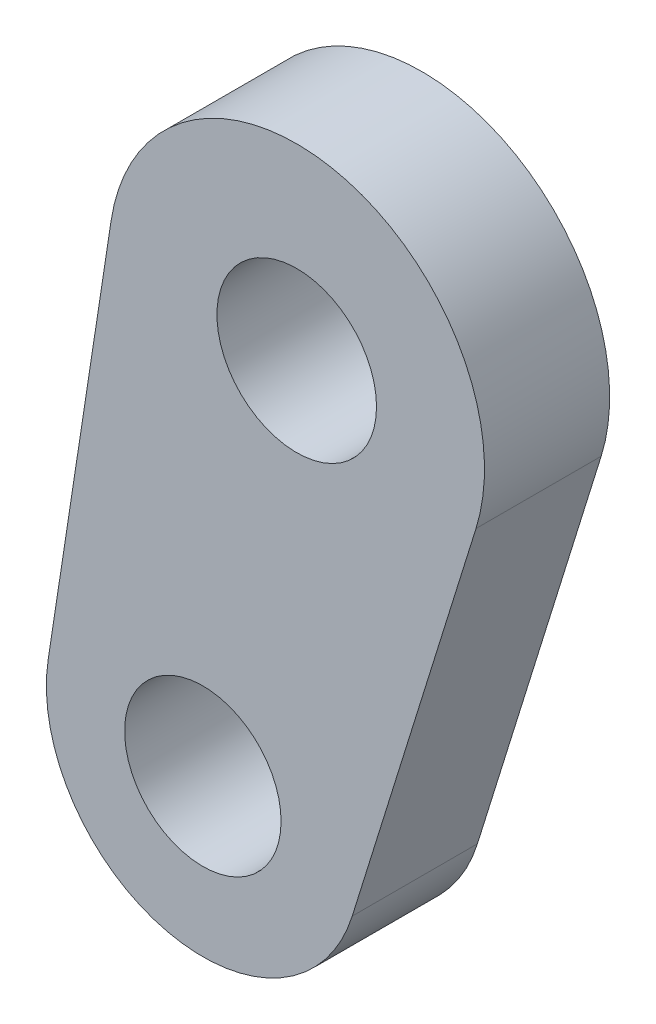
ISO-10303-21;
HEADER;
FILE_DESCRIPTION(('STEP AP214'),'2;1');
FILE_NAME('part.step','',(''),(''),'','','');
FILE_SCHEMA(('AUTOMOTIVE_DESIGN { 1 0 10303 214 1 1 1 1 }'));
ENDSEC;
DATA;
#1=APPLICATION_CONTEXT('core data for automotive mechanical design processes');
#2=APPLICATION_PROTOCOL_DEFINITION('international standard','automotive_design',2000,#1);
#3=PRODUCT_CONTEXT('',#1,'mechanical');
#4=PRODUCT('Part','Part','',(#3));
#5=PRODUCT_RELATED_PRODUCT_CATEGORY('part','',(#4));
#6=PRODUCT_DEFINITION_FORMATION('','',#4);
#7=PRODUCT_DEFINITION_CONTEXT('part definition',#1,'design');
#8=PRODUCT_DEFINITION('design','',#6,#7);
#9=PRODUCT_DEFINITION_SHAPE('','',#8);
#10=(LENGTH_UNIT() NAMED_UNIT(*) SI_UNIT(.MILLI.,.METRE.));
#11=(NAMED_UNIT(*) PLANE_ANGLE_UNIT() SI_UNIT($,.RADIAN.));
#12=(NAMED_UNIT(*) SI_UNIT($,.STERADIAN.) SOLID_ANGLE_UNIT());
#13=UNCERTAINTY_MEASURE_WITH_UNIT(LENGTH_MEASURE(1.E-05),#10,'distance_accuracy_value','');
#14=(GEOMETRIC_REPRESENTATION_CONTEXT(3) GLOBAL_UNCERTAINTY_ASSIGNED_CONTEXT((#13)) GLOBAL_UNIT_ASSIGNED_CONTEXT((#10,
#11,#12)) REPRESENTATION_CONTEXT('',''));
#15=CARTESIAN_POINT('',(0.,0.,0.));
#16=DIRECTION('',(0.,0.,1.));
#17=DIRECTION('',(1.,0.,0.));
#18=AXIS2_PLACEMENT_3D('',#15,#16,#17);
#19=CARTESIAN_POINT('',(-6.,-26.,52.4));
#20=DIRECTION('',(0.,0.,1.));
#21=DIRECTION('',(1.,0.,0.));
#22=AXIS2_PLACEMENT_3D('',#19,#20,#21);
#23=PLANE('',#22);
#24=CARTESIAN_POINT('',(0.,0.,52.4));
#25=DIRECTION('',(0.,0.,1.));
#26=DIRECTION('',(1.,0.,0.));
#27=AXIS2_PLACEMENT_3D('',#24,#25,#26);
#28=CIRCLE('',#27,5.1);
#29=CARTESIAN_POINT('',(5.1,0.,52.4));
#30=VERTEX_POINT('',#29);
#31=EDGE_CURVE('E103',#30,#30,#28,.T.);
#32=ORIENTED_EDGE('',*,*,#31,.F.);
#33=EDGE_LOOP('',(#32));
#34=FACE_BOUND('',#33,.T.);
#35=CARTESIAN_POINT('',(-6.,-26.,52.4));
#36=DIRECTION('',(0.,0.,1.));
#37=DIRECTION('',(1.,0.,0.));
#38=AXIS2_PLACEMENT_3D('',#35,#36,#37);
#39=CIRCLE('',#38,10.);
#40=CARTESIAN_POINT('',(-15.8850421934523,-24.4880671861264,52.4));
#41=VERTEX_POINT('',#40);
#42=CARTESIAN_POINT('',(3.5479635417669,-28.972606971177,52.4));
#43=VERTEX_POINT('',#42);
#44=EDGE_CURVE('E88',#41,#43,#39,.T.);
#45=ORIENTED_EDGE('',*,*,#44,.T.);
#46=DIRECTION('',(0.297260697117698,0.95479635417669,0.));
#47=VECTOR('',#46,1.);
#48=CARTESIAN_POINT('',(3.5479635417669,-28.972606971177,52.4));
#49=LINE('',#48,#47);
#50=CARTESIAN_POINT('',(11.4575562501203,-3.56712836541238,52.4));
#51=VERTEX_POINT('',#50);
#52=EDGE_CURVE('E83',#43,#51,#49,.T.);
#53=ORIENTED_EDGE('',*,*,#52,.T.);
#54=CARTESIAN_POINT('',(0.,0.,52.4));
#55=DIRECTION('',(0.,0.,1.));
#56=DIRECTION('',(1.,0.,0.));
#57=AXIS2_PLACEMENT_3D('',#54,#55,#56);
#58=CIRCLE('',#57,12.);
#59=CARTESIAN_POINT('',(-11.8620506321428,1.81431937664832,52.4));
#60=VERTEX_POINT('',#59);
#61=EDGE_CURVE('E86',#51,#60,#58,.T.);
#62=ORIENTED_EDGE('',*,*,#61,.T.);
#63=DIRECTION('',(-0.151193281387361,-0.98850421934523,0.));
#64=VECTOR('',#63,1.);
#65=CARTESIAN_POINT('',(-11.8620506321428,1.81431937664833,52.4));
#66=LINE('',#65,#64);
#67=EDGE_CURVE('E53',#60,#41,#66,.T.);
#68=ORIENTED_EDGE('',*,*,#67,.T.);
#69=EDGE_LOOP('',(#45,#53,#62,#68));
#70=FACE_BOUND('',#69,.T.);
#71=CARTESIAN_POINT('',(-6.,-26.,52.4));
#72=DIRECTION('',(0.,0.,1.));
#73=DIRECTION('',(1.,0.,0.));
#74=AXIS2_PLACEMENT_3D('',#71,#72,#73);
#75=CIRCLE('',#74,5.);
#76=CARTESIAN_POINT('',(-1.,-26.,52.4));
#77=VERTEX_POINT('',#76);
#78=EDGE_CURVE('E118',#77,#77,#75,.T.);
#79=ORIENTED_EDGE('',*,*,#78,.F.);
#80=EDGE_LOOP('',(#79));
#81=FACE_BOUND('',#80,.T.);
#82=ADVANCED_FACE('F36',(#34,#70,#81),#23,.T.);
#83=CARTESIAN_POINT('',(-6.,-26.,44.4));
#84=DIRECTION('',(0.,0.,1.));
#85=DIRECTION('',(1.,0.,0.));
#86=AXIS2_PLACEMENT_3D('',#83,#84,#85);
#87=PLANE('',#86);
#88=CARTESIAN_POINT('',(-6.,-26.,44.4));
#89=DIRECTION('',(0.,0.,1.));
#90=DIRECTION('',(1.,0.,0.));
#91=AXIS2_PLACEMENT_3D('',#88,#89,#90);
#92=CIRCLE('',#91,10.);
#93=CARTESIAN_POINT('',(-15.8850421934523,-24.4880671861264,44.4));
#94=VERTEX_POINT('',#93);
#95=CARTESIAN_POINT('',(3.5479635417669,-28.972606971177,44.4));
#96=VERTEX_POINT('',#95);
#97=EDGE_CURVE('E100',#94,#96,#92,.T.);
#98=ORIENTED_EDGE('',*,*,#97,.F.);
#99=DIRECTION('',(-0.151193281387361,-0.98850421934523,0.));
#100=VECTOR('',#99,1.);
#101=CARTESIAN_POINT('',(-11.8620506321428,1.81431937664833,44.4));
#102=LINE('',#101,#100);
#103=CARTESIAN_POINT('',(-11.8620506321428,1.81431937664832,44.4));
#104=VERTEX_POINT('',#103);
#105=EDGE_CURVE('E76',#104,#94,#102,.T.);
#106=ORIENTED_EDGE('',*,*,#105,.F.);
#107=CARTESIAN_POINT('',(0.,0.,44.4));
#108=DIRECTION('',(0.,0.,1.));
#109=DIRECTION('',(1.,0.,0.));
#110=AXIS2_PLACEMENT_3D('',#107,#108,#109);
#111=CIRCLE('',#110,12.);
#112=CARTESIAN_POINT('',(11.4575562501203,-3.56712836541238,44.4));
#113=VERTEX_POINT('',#112);
#114=EDGE_CURVE('E70',#113,#104,#111,.T.);
#115=ORIENTED_EDGE('',*,*,#114,.F.);
#116=DIRECTION('',(0.297260697117698,0.95479635417669,0.));
#117=VECTOR('',#116,1.);
#118=CARTESIAN_POINT('',(3.5479635417669,-28.972606971177,44.4));
#119=LINE('',#118,#117);
#120=EDGE_CURVE('E92',#96,#113,#119,.T.);
#121=ORIENTED_EDGE('',*,*,#120,.F.);
#122=EDGE_LOOP('',(#98,#106,#115,#121));
#123=FACE_BOUND('',#122,.T.);
#124=CARTESIAN_POINT('',(0.,0.,44.4));
#125=DIRECTION('',(0.,0.,1.));
#126=DIRECTION('',(1.,0.,0.));
#127=AXIS2_PLACEMENT_3D('',#124,#125,#126);
#128=CIRCLE('',#127,5.1);
#129=CARTESIAN_POINT('',(5.1,0.,44.4));
#130=VERTEX_POINT('',#129);
#131=EDGE_CURVE('E115',#130,#130,#128,.T.);
#132=ORIENTED_EDGE('',*,*,#131,.T.);
#133=EDGE_LOOP('',(#132));
#134=FACE_BOUND('',#133,.T.);
#135=CARTESIAN_POINT('',(-6.,-26.,44.4));
#136=DIRECTION('',(0.,0.,1.));
#137=DIRECTION('',(1.,0.,0.));
#138=AXIS2_PLACEMENT_3D('',#135,#136,#137);
#139=CIRCLE('',#138,5.);
#140=CARTESIAN_POINT('',(-1.,-26.,44.4));
#141=VERTEX_POINT('',#140);
#142=EDGE_CURVE('E121',#141,#141,#139,.T.);
#143=ORIENTED_EDGE('',*,*,#142,.T.);
#144=EDGE_LOOP('',(#143));
#145=FACE_BOUND('',#144,.T.);
#146=ADVANCED_FACE('F111',(#123,#134,#145),#87,.F.);
#147=CARTESIAN_POINT('',(-6.,-26.,52.4));
#148=DIRECTION('',(0.,0.,-1.));
#149=DIRECTION('',(-1.,0.,0.));
#150=AXIS2_PLACEMENT_3D('',#147,#148,#149);
#151=CYLINDRICAL_SURFACE('',#150,10.);
#152=ORIENTED_EDGE('',*,*,#97,.T.);
#153=DIRECTION('',(0.,0.,-1.));
#154=VECTOR('',#153,1.);
#155=CARTESIAN_POINT('',(3.5479635417669,-28.972606971177,52.4));
#156=LINE('',#155,#154);
#157=EDGE_CURVE('E11',#43,#96,#156,.T.);
#158=ORIENTED_EDGE('',*,*,#157,.F.);
#159=ORIENTED_EDGE('',*,*,#44,.F.);
#160=DIRECTION('',(0.,0.,-1.));
#161=VECTOR('',#160,1.);
#162=CARTESIAN_POINT('',(-15.8850421934523,-24.4880671861264,52.4));
#163=LINE('',#162,#161);
#164=EDGE_CURVE('E96',#41,#94,#163,.T.);
#165=ORIENTED_EDGE('',*,*,#164,.T.);
#166=EDGE_LOOP('',(#152,#158,#159,#165));
#167=FACE_BOUND('',#166,.T.);
#168=ADVANCED_FACE('F38',(#167),#151,.T.);
#169=CARTESIAN_POINT('',(3.5479635417669,-28.972606971177,52.4));
#170=DIRECTION('',(-0.954796354176691,0.297260697117698,0.));
#171=DIRECTION('',(-0.297260697117698,-0.954796354176691,0.));
#172=AXIS2_PLACEMENT_3D('',#169,#170,#171);
#173=PLANE('',#172);
#174=ORIENTED_EDGE('',*,*,#120,.T.);
#175=DIRECTION('',(0.,0.,-1.));
#176=VECTOR('',#175,1.);
#177=CARTESIAN_POINT('',(11.4575562501203,-3.56712836541238,52.4));
#178=LINE('',#177,#176);
#179=EDGE_CURVE('E45',#51,#113,#178,.T.);
#180=ORIENTED_EDGE('',*,*,#179,.F.);
#181=ORIENTED_EDGE('',*,*,#52,.F.);
#182=ORIENTED_EDGE('',*,*,#157,.T.);
#183=EDGE_LOOP('',(#174,#180,#181,#182));
#184=FACE_BOUND('',#183,.T.);
#185=ADVANCED_FACE('F91',(#184),#173,.F.);
#186=CARTESIAN_POINT('',(0.,0.,52.4));
#187=DIRECTION('',(0.,0.,-1.));
#188=DIRECTION('',(-1.,0.,0.));
#189=AXIS2_PLACEMENT_3D('',#186,#187,#188);
#190=CYLINDRICAL_SURFACE('',#189,12.);
#191=ORIENTED_EDGE('',*,*,#114,.T.);
#192=DIRECTION('',(0.,0.,-1.));
#193=VECTOR('',#192,1.);
#194=CARTESIAN_POINT('',(-11.8620506321428,1.81431937664832,52.4));
#195=LINE('',#194,#193);
#196=EDGE_CURVE('E93',#60,#104,#195,.T.);
#197=ORIENTED_EDGE('',*,*,#196,.F.);
#198=ORIENTED_EDGE('',*,*,#61,.F.);
#199=ORIENTED_EDGE('',*,*,#179,.T.);
#200=EDGE_LOOP('',(#191,#197,#198,#199));
#201=FACE_BOUND('',#200,.T.);
#202=ADVANCED_FACE('F94',(#201),#190,.T.);
#203=CARTESIAN_POINT('',(-11.8620506321428,1.81431937664833,52.4));
#204=DIRECTION('',(0.98850421934523,-0.151193281387361,0.));
#205=DIRECTION('',(0.151193281387361,0.98850421934523,0.));
#206=AXIS2_PLACEMENT_3D('',#203,#204,#205);
#207=PLANE('',#206);
#208=ORIENTED_EDGE('',*,*,#105,.T.);
#209=ORIENTED_EDGE('',*,*,#164,.F.);
#210=ORIENTED_EDGE('',*,*,#67,.F.);
#211=ORIENTED_EDGE('',*,*,#196,.T.);
#212=EDGE_LOOP('',(#208,#209,#210,#211));
#213=FACE_BOUND('',#212,.T.);
#214=ADVANCED_FACE('F108',(#213),#207,.F.);
#215=CARTESIAN_POINT('',(0.,0.,52.4));
#216=DIRECTION('',(0.,0.,-1.));
#217=DIRECTION('',(-1.,0.,0.));
#218=AXIS2_PLACEMENT_3D('',#215,#216,#217);
#219=CYLINDRICAL_SURFACE('',#218,5.1);
#220=ORIENTED_EDGE('',*,*,#31,.T.);
#221=EDGE_LOOP('',(#220));
#222=FACE_BOUND('',#221,.T.);
#223=ORIENTED_EDGE('',*,*,#131,.F.);
#224=EDGE_LOOP('',(#223));
#225=FACE_BOUND('',#224,.T.);
#226=ADVANCED_FACE('F138',(#222,#225),#219,.F.);
#227=CARTESIAN_POINT('',(-6.,-26.,52.4));
#228=DIRECTION('',(0.,0.,-1.));
#229=DIRECTION('',(-1.,0.,0.));
#230=AXIS2_PLACEMENT_3D('',#227,#228,#229);
#231=CYLINDRICAL_SURFACE('',#230,5.);
#232=ORIENTED_EDGE('',*,*,#78,.T.);
#233=EDGE_LOOP('',(#232));
#234=FACE_BOUND('',#233,.T.);
#235=ORIENTED_EDGE('',*,*,#142,.F.);
#236=EDGE_LOOP('',(#235));
#237=FACE_BOUND('',#236,.T.);
#238=ADVANCED_FACE('F127',(#234,#237),#231,.F.);
#239=CLOSED_SHELL('',(#82,#146,#168,#185,#202,#214,#226,#238));
#240=MANIFOLD_SOLID_BREP('B2',#239);
#241=ADVANCED_BREP_SHAPE_REPRESENTATION('',(#18,#240),#14);
#242=SHAPE_DEFINITION_REPRESENTATION(#9,#241);
ENDSEC;
END-ISO-10303-21;
